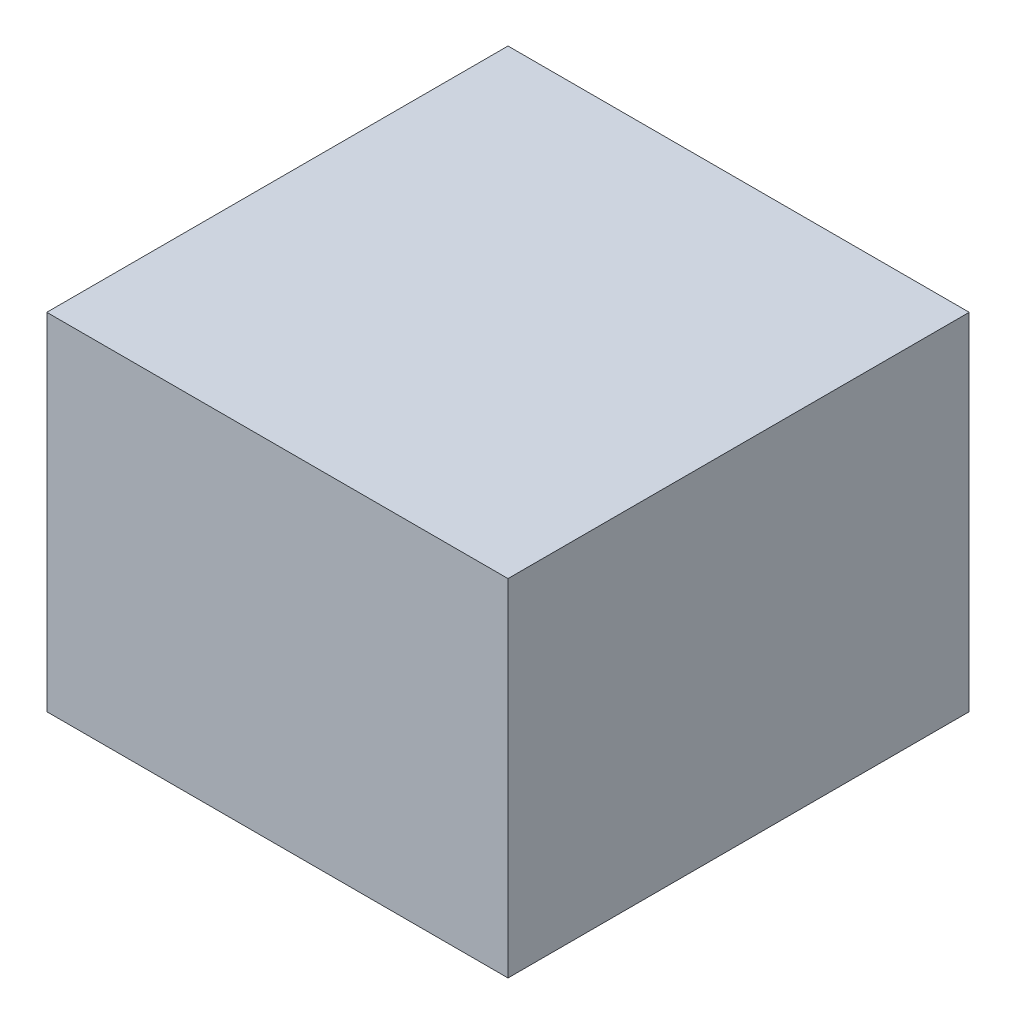
ISO-10303-21;
HEADER;
FILE_DESCRIPTION(('STEP AP214'),'2;1');
FILE_NAME('part.step','',(''),(''),'','','');
FILE_SCHEMA(('AUTOMOTIVE_DESIGN { 1 0 10303 214 1 1 1 1 }'));
ENDSEC;
DATA;
#1=APPLICATION_CONTEXT('core data for automotive mechanical design processes');
#2=APPLICATION_PROTOCOL_DEFINITION('international standard','automotive_design',2000,#1);
#3=PRODUCT_CONTEXT('',#1,'mechanical');
#4=PRODUCT('Part','Part','',(#3));
#5=PRODUCT_RELATED_PRODUCT_CATEGORY('part','',(#4));
#6=PRODUCT_DEFINITION_FORMATION('','',#4);
#7=PRODUCT_DEFINITION_CONTEXT('part definition',#1,'design');
#8=PRODUCT_DEFINITION('design','',#6,#7);
#9=PRODUCT_DEFINITION_SHAPE('','',#8);
#10=(LENGTH_UNIT() NAMED_UNIT(*) SI_UNIT(.MILLI.,.METRE.));
#11=(NAMED_UNIT(*) PLANE_ANGLE_UNIT() SI_UNIT($,.RADIAN.));
#12=(NAMED_UNIT(*) SI_UNIT($,.STERADIAN.) SOLID_ANGLE_UNIT());
#13=UNCERTAINTY_MEASURE_WITH_UNIT(LENGTH_MEASURE(1.E-05),#10,'distance_accuracy_value','');
#14=(GEOMETRIC_REPRESENTATION_CONTEXT(3) GLOBAL_UNCERTAINTY_ASSIGNED_CONTEXT((#13)) GLOBAL_UNIT_ASSIGNED_CONTEXT((#10,
#11,#12)) REPRESENTATION_CONTEXT('',''));
#15=CARTESIAN_POINT('',(0.,0.,0.));
#16=DIRECTION('',(0.,0.,1.));
#17=DIRECTION('',(1.,0.,0.));
#18=AXIS2_PLACEMENT_3D('',#15,#16,#17);
#19=CARTESIAN_POINT('',(300.,320.,-680.));
#20=DIRECTION('',(-1.,0.,0.));
#21=DIRECTION('',(0.,0.,1.));
#22=AXIS2_PLACEMENT_3D('',#19,#20,#21);
#23=PLANE('',#22);
#24=DIRECTION('',(0.,-1.,0.));
#25=VECTOR('',#24,1.);
#26=CARTESIAN_POINT('',(300.,320.,-640.));
#27=LINE('',#26,#25);
#28=CARTESIAN_POINT('',(300.,350.,-640.));
#29=VERTEX_POINT('',#28);
#30=CARTESIAN_POINT('',(300.,320.,-640.));
#31=VERTEX_POINT('',#30);
#32=EDGE_CURVE('E103',#29,#31,#27,.T.);
#33=ORIENTED_EDGE('',*,*,#32,.F.);
#34=DIRECTION('',(0.,0.,1.));
#35=VECTOR('',#34,1.);
#36=CARTESIAN_POINT('',(300.,350.,-680.));
#37=LINE('',#36,#35);
#38=CARTESIAN_POINT('',(300.,350.,-680.));
#39=VERTEX_POINT('',#38);
#40=EDGE_CURVE('E11',#39,#29,#37,.T.);
#41=ORIENTED_EDGE('',*,*,#40,.F.);
#42=DIRECTION('',(0.,-1.,0.));
#43=VECTOR('',#42,1.);
#44=CARTESIAN_POINT('',(300.,320.,-680.));
#45=LINE('',#44,#43);
#46=CARTESIAN_POINT('',(300.,320.,-680.));
#47=VERTEX_POINT('',#46);
#48=EDGE_CURVE('E97',#39,#47,#45,.T.);
#49=ORIENTED_EDGE('',*,*,#48,.T.);
#50=DIRECTION('',(0.,0.,1.));
#51=VECTOR('',#50,1.);
#52=CARTESIAN_POINT('',(300.,320.,-680.));
#53=LINE('',#52,#51);
#54=EDGE_CURVE('E42',#47,#31,#53,.T.);
#55=ORIENTED_EDGE('',*,*,#54,.T.);
#56=EDGE_LOOP('',(#33,#41,#49,#55));
#57=FACE_BOUND('',#56,.T.);
#58=ADVANCED_FACE('F39',(#57),#23,.T.);
#59=CARTESIAN_POINT('',(300.,350.,-680.));
#60=DIRECTION('',(0.,1.,0.));
#61=DIRECTION('',(0.,0.,1.));
#62=AXIS2_PLACEMENT_3D('',#59,#60,#61);
#63=PLANE('',#62);
#64=DIRECTION('',(-1.,0.,0.));
#65=VECTOR('',#64,1.);
#66=CARTESIAN_POINT('',(300.,350.,-640.));
#67=LINE('',#66,#65);
#68=CARTESIAN_POINT('',(340.,350.,-640.));
#69=VERTEX_POINT('',#68);
#70=EDGE_CURVE('E99',#69,#29,#67,.T.);
#71=ORIENTED_EDGE('',*,*,#70,.F.);
#72=DIRECTION('',(0.,0.,1.));
#73=VECTOR('',#72,1.);
#74=CARTESIAN_POINT('',(340.,350.,-680.));
#75=LINE('',#74,#73);
#76=CARTESIAN_POINT('',(340.,350.,-680.));
#77=VERTEX_POINT('',#76);
#78=EDGE_CURVE('E48',#77,#69,#75,.T.);
#79=ORIENTED_EDGE('',*,*,#78,.F.);
#80=DIRECTION('',(-1.,0.,0.));
#81=VECTOR('',#80,1.);
#82=CARTESIAN_POINT('',(300.,350.,-680.));
#83=LINE('',#82,#81);
#84=EDGE_CURVE('E94',#77,#39,#83,.T.);
#85=ORIENTED_EDGE('',*,*,#84,.T.);
#86=ORIENTED_EDGE('',*,*,#40,.T.);
#87=EDGE_LOOP('',(#71,#79,#85,#86));
#88=FACE_BOUND('',#87,.T.);
#89=ADVANCED_FACE('F113',(#88),#63,.T.);
#90=CARTESIAN_POINT('',(340.,320.,-680.));
#91=DIRECTION('',(1.,0.,0.));
#92=DIRECTION('',(0.,0.,-1.));
#93=AXIS2_PLACEMENT_3D('',#90,#91,#92);
#94=PLANE('',#93);
#95=DIRECTION('',(0.,1.,0.));
#96=VECTOR('',#95,1.);
#97=CARTESIAN_POINT('',(340.,320.,-640.));
#98=LINE('',#97,#96);
#99=CARTESIAN_POINT('',(340.,320.,-640.));
#100=VERTEX_POINT('',#99);
#101=EDGE_CURVE('E89',#100,#69,#98,.T.);
#102=ORIENTED_EDGE('',*,*,#101,.F.);
#103=DIRECTION('',(0.,0.,1.));
#104=VECTOR('',#103,1.);
#105=CARTESIAN_POINT('',(340.,320.,-680.));
#106=LINE('',#105,#104);
#107=CARTESIAN_POINT('',(340.,320.,-680.));
#108=VERTEX_POINT('',#107);
#109=EDGE_CURVE('E84',#108,#100,#106,.T.);
#110=ORIENTED_EDGE('',*,*,#109,.F.);
#111=DIRECTION('',(0.,1.,0.));
#112=VECTOR('',#111,1.);
#113=CARTESIAN_POINT('',(340.,320.,-680.));
#114=LINE('',#113,#112);
#115=EDGE_CURVE('E87',#108,#77,#114,.T.);
#116=ORIENTED_EDGE('',*,*,#115,.T.);
#117=ORIENTED_EDGE('',*,*,#78,.T.);
#118=EDGE_LOOP('',(#102,#110,#116,#117));
#119=FACE_BOUND('',#118,.T.);
#120=ADVANCED_FACE('F86',(#119),#94,.T.);
#121=CARTESIAN_POINT('',(300.,320.,-680.));
#122=DIRECTION('',(0.,-1.,0.));
#123=DIRECTION('',(0.,0.,-1.));
#124=AXIS2_PLACEMENT_3D('',#121,#122,#123);
#125=PLANE('',#124);
#126=DIRECTION('',(1.,0.,0.));
#127=VECTOR('',#126,1.);
#128=CARTESIAN_POINT('',(300.,320.,-640.));
#129=LINE('',#128,#127);
#130=EDGE_CURVE('E106',#31,#100,#129,.T.);
#131=ORIENTED_EDGE('',*,*,#130,.F.);
#132=ORIENTED_EDGE('',*,*,#54,.F.);
#133=DIRECTION('',(1.,0.,0.));
#134=VECTOR('',#133,1.);
#135=CARTESIAN_POINT('',(300.,320.,-680.));
#136=LINE('',#135,#134);
#137=EDGE_CURVE('E93',#47,#108,#136,.T.);
#138=ORIENTED_EDGE('',*,*,#137,.T.);
#139=ORIENTED_EDGE('',*,*,#109,.T.);
#140=EDGE_LOOP('',(#131,#132,#138,#139));
#141=FACE_BOUND('',#140,.T.);
#142=ADVANCED_FACE('F96',(#141),#125,.T.);
#143=CARTESIAN_POINT('',(0.,0.,-680.));
#144=DIRECTION('',(0.,0.,-1.));
#145=DIRECTION('',(-1.,0.,0.));
#146=AXIS2_PLACEMENT_3D('',#143,#144,#145);
#147=PLANE('',#146);
#148=ORIENTED_EDGE('',*,*,#48,.F.);
#149=ORIENTED_EDGE('',*,*,#84,.F.);
#150=ORIENTED_EDGE('',*,*,#115,.F.);
#151=ORIENTED_EDGE('',*,*,#137,.F.);
#152=EDGE_LOOP('',(#148,#149,#150,#151));
#153=FACE_BOUND('',#152,.T.);
#154=ADVANCED_FACE('F92',(#153),#147,.T.);
#155=CARTESIAN_POINT('',(0.,0.,-640.));
#156=DIRECTION('',(0.,0.,-1.));
#157=DIRECTION('',(-1.,0.,0.));
#158=AXIS2_PLACEMENT_3D('',#155,#156,#157);
#159=PLANE('',#158);
#160=ORIENTED_EDGE('',*,*,#32,.T.);
#161=ORIENTED_EDGE('',*,*,#130,.T.);
#162=ORIENTED_EDGE('',*,*,#101,.T.);
#163=ORIENTED_EDGE('',*,*,#70,.T.);
#164=EDGE_LOOP('',(#160,#161,#162,#163));
#165=FACE_BOUND('',#164,.T.);
#166=ADVANCED_FACE('F112',(#165),#159,.F.);
#167=CLOSED_SHELL('',(#58,#89,#120,#142,#154,#166));
#168=MANIFOLD_SOLID_BREP('B2',#167);
#169=ADVANCED_BREP_SHAPE_REPRESENTATION('',(#18,#168),#14);
#170=SHAPE_DEFINITION_REPRESENTATION(#9,#169);
ENDSEC;
END-ISO-10303-21;
